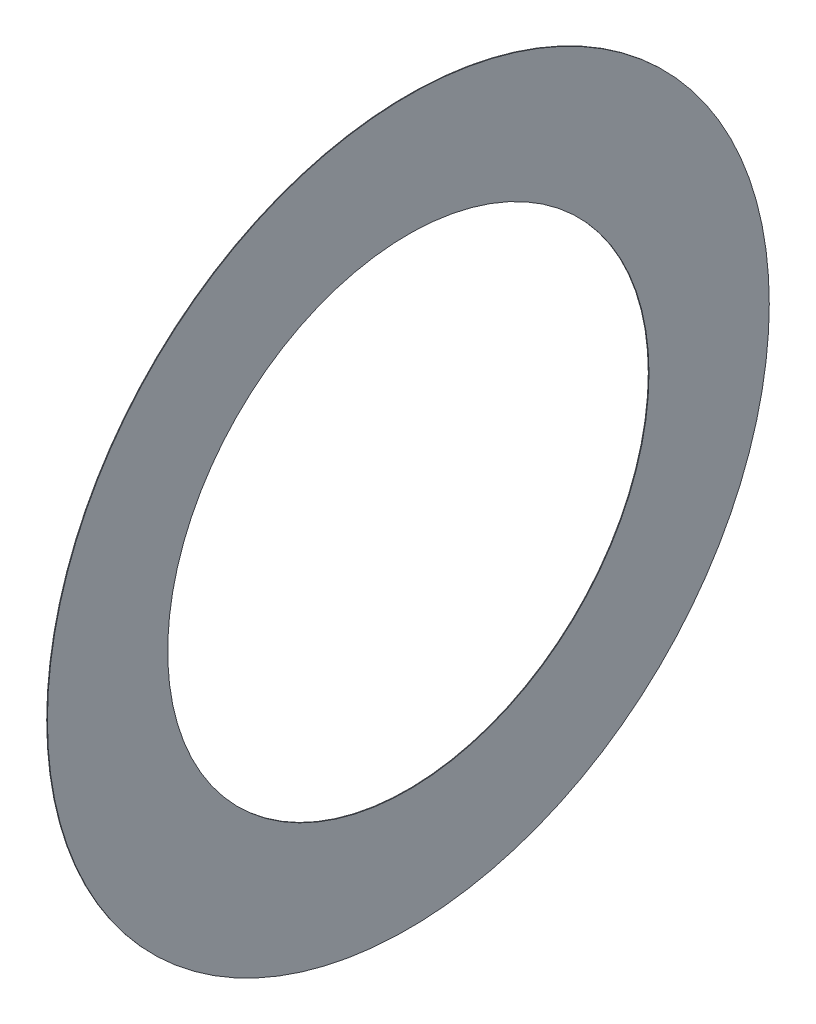
ISO-10303-21;
HEADER;
FILE_DESCRIPTION(('STEP AP214'),'2;1');
FILE_NAME('part.step','',(''),(''),'','','');
FILE_SCHEMA(('AUTOMOTIVE_DESIGN { 1 0 10303 214 1 1 1 1 }'));
ENDSEC;
DATA;
#1=APPLICATION_CONTEXT('core data for automotive mechanical design processes');
#2=APPLICATION_PROTOCOL_DEFINITION('international standard','automotive_design',2000,#1);
#3=PRODUCT_CONTEXT('',#1,'mechanical');
#4=PRODUCT('Part','Part','',(#3));
#5=PRODUCT_RELATED_PRODUCT_CATEGORY('part','',(#4));
#6=PRODUCT_DEFINITION_FORMATION('','',#4);
#7=PRODUCT_DEFINITION_CONTEXT('part definition',#1,'design');
#8=PRODUCT_DEFINITION('design','',#6,#7);
#9=PRODUCT_DEFINITION_SHAPE('','',#8);
#10=(LENGTH_UNIT() NAMED_UNIT(*) SI_UNIT(.MILLI.,.METRE.));
#11=(NAMED_UNIT(*) PLANE_ANGLE_UNIT() SI_UNIT($,.RADIAN.));
#12=(NAMED_UNIT(*) SI_UNIT($,.STERADIAN.) SOLID_ANGLE_UNIT());
#13=UNCERTAINTY_MEASURE_WITH_UNIT(LENGTH_MEASURE(1.E-05),#10,'distance_accuracy_value','');
#14=(GEOMETRIC_REPRESENTATION_CONTEXT(3) GLOBAL_UNCERTAINTY_ASSIGNED_CONTEXT((#13)) GLOBAL_UNIT_ASSIGNED_CONTEXT((#10,
#11,#12)) REPRESENTATION_CONTEXT('',''));
#15=CARTESIAN_POINT('',(0.,0.,0.));
#16=DIRECTION('',(0.,0.,1.));
#17=DIRECTION('',(1.,0.,0.));
#18=AXIS2_PLACEMENT_3D('',#15,#16,#17);
#19=CARTESIAN_POINT('',(0.0254,0.,0.));
#20=DIRECTION('',(1.,0.,0.));
#21=DIRECTION('',(0.,0.,-1.));
#22=AXIS2_PLACEMENT_3D('',#19,#20,#21);
#23=PLANE('',#22);
#24=CARTESIAN_POINT('',(0.0254,0.,0.));
#25=DIRECTION('',(1.,0.,0.));
#26=DIRECTION('',(0.,0.,-1.));
#27=AXIS2_PLACEMENT_3D('',#24,#25,#26);
#28=CIRCLE('',#27,14.2875);
#29=CARTESIAN_POINT('',(0.0254,0.,-14.2875));
#30=VERTEX_POINT('',#29);
#31=EDGE_CURVE('E10',#30,#30,#28,.T.);
#32=ORIENTED_EDGE('',*,*,#31,.T.);
#33=EDGE_LOOP('',(#32));
#34=FACE_BOUND('',#33,.T.);
#35=CARTESIAN_POINT('',(0.0254,0.,0.));
#36=DIRECTION('',(1.,0.,0.));
#37=DIRECTION('',(0.,0.,-1.));
#38=AXIS2_PLACEMENT_3D('',#35,#36,#37);
#39=CIRCLE('',#38,9.525);
#40=CARTESIAN_POINT('',(0.0254,0.,-9.525));
#41=VERTEX_POINT('',#40);
#42=EDGE_CURVE('E41',#41,#41,#39,.T.);
#43=ORIENTED_EDGE('',*,*,#42,.F.);
#44=EDGE_LOOP('',(#43));
#45=FACE_BOUND('',#44,.T.);
#46=ADVANCED_FACE('F30',(#34,#45),#23,.T.);
#47=CARTESIAN_POINT('',(0.,0.,0.));
#48=DIRECTION('',(1.,0.,0.));
#49=DIRECTION('',(0.,0.,-1.));
#50=AXIS2_PLACEMENT_3D('',#47,#48,#49);
#51=PLANE('',#50);
#52=CARTESIAN_POINT('',(0.,0.,0.));
#53=DIRECTION('',(1.,0.,0.));
#54=DIRECTION('',(0.,0.,-1.));
#55=AXIS2_PLACEMENT_3D('',#52,#53,#54);
#56=CIRCLE('',#55,14.2875);
#57=CARTESIAN_POINT('',(0.,0.,-14.2875));
#58=VERTEX_POINT('',#57);
#59=EDGE_CURVE('E34',#58,#58,#56,.T.);
#60=ORIENTED_EDGE('',*,*,#59,.F.);
#61=EDGE_LOOP('',(#60));
#62=FACE_BOUND('',#61,.T.);
#63=CARTESIAN_POINT('',(0.,0.,0.));
#64=DIRECTION('',(1.,0.,0.));
#65=DIRECTION('',(0.,0.,-1.));
#66=AXIS2_PLACEMENT_3D('',#63,#64,#65);
#67=CIRCLE('',#66,9.525);
#68=CARTESIAN_POINT('',(0.,0.,-9.525));
#69=VERTEX_POINT('',#68);
#70=EDGE_CURVE('E43',#69,#69,#67,.T.);
#71=ORIENTED_EDGE('',*,*,#70,.T.);
#72=EDGE_LOOP('',(#71));
#73=FACE_BOUND('',#72,.T.);
#74=ADVANCED_FACE('F53',(#62,#73),#51,.F.);
#75=CARTESIAN_POINT('',(0.0254,0.,0.));
#76=DIRECTION('',(-1.,0.,0.));
#77=DIRECTION('',(0.,0.,1.));
#78=AXIS2_PLACEMENT_3D('',#75,#76,#77);
#79=CYLINDRICAL_SURFACE('',#78,14.2875);
#80=ORIENTED_EDGE('',*,*,#31,.F.);
#81=EDGE_LOOP('',(#80));
#82=FACE_BOUND('',#81,.T.);
#83=ORIENTED_EDGE('',*,*,#59,.T.);
#84=EDGE_LOOP('',(#83));
#85=FACE_BOUND('',#84,.T.);
#86=ADVANCED_FACE('F32',(#82,#85),#79,.T.);
#87=CARTESIAN_POINT('',(0.0254,0.,0.));
#88=DIRECTION('',(-1.,0.,0.));
#89=DIRECTION('',(0.,0.,1.));
#90=AXIS2_PLACEMENT_3D('',#87,#88,#89);
#91=CYLINDRICAL_SURFACE('',#90,9.525);
#92=ORIENTED_EDGE('',*,*,#42,.T.);
#93=EDGE_LOOP('',(#92));
#94=FACE_BOUND('',#93,.T.);
#95=ORIENTED_EDGE('',*,*,#70,.F.);
#96=EDGE_LOOP('',(#95));
#97=FACE_BOUND('',#96,.T.);
#98=ADVANCED_FACE('F49',(#94,#97),#91,.F.);
#99=CLOSED_SHELL('',(#46,#74,#86,#98));
#100=MANIFOLD_SOLID_BREP('B2',#99);
#101=ADVANCED_BREP_SHAPE_REPRESENTATION('',(#18,#100),#14);
#102=SHAPE_DEFINITION_REPRESENTATION(#9,#101);
ENDSEC;
END-ISO-10303-21;
